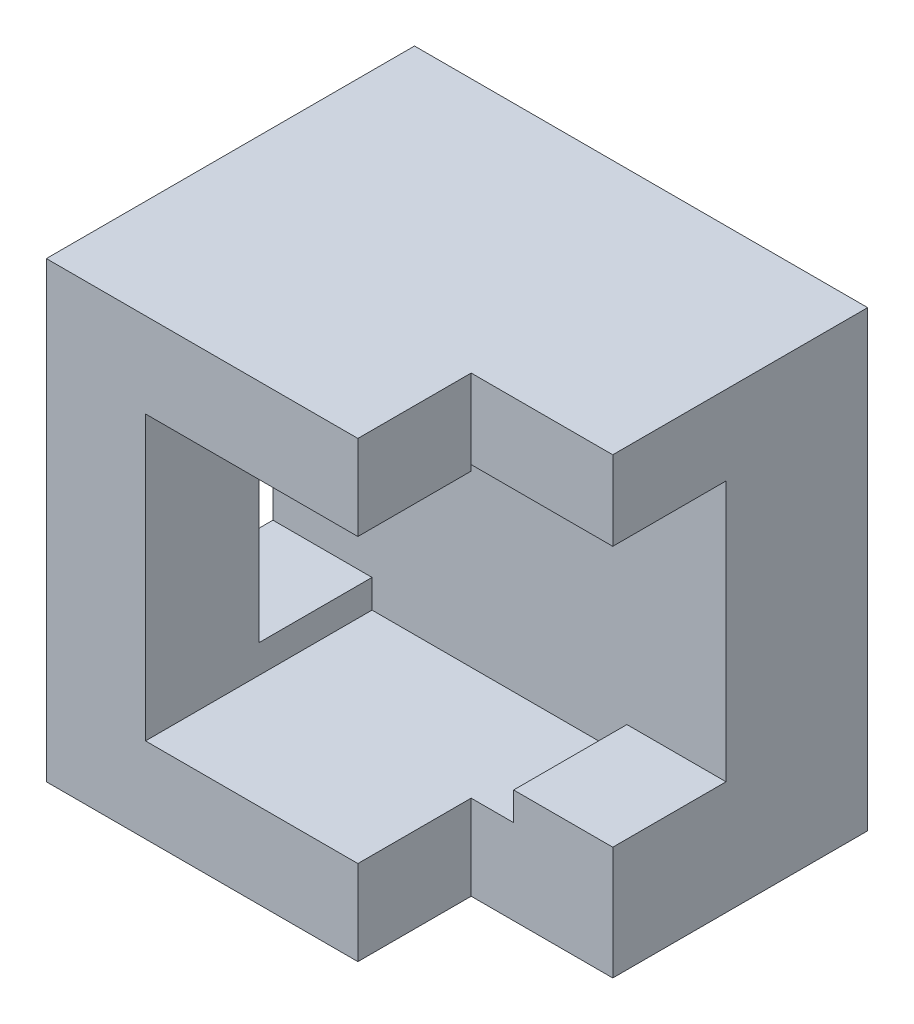
ISO-10303-21;
HEADER;
FILE_DESCRIPTION(('STEP AP214'),'2;1');
FILE_NAME('part.step','',(''),(''),'','','');
FILE_SCHEMA(('AUTOMOTIVE_DESIGN { 1 0 10303 214 1 1 1 1 }'));
ENDSEC;
DATA;
#1=APPLICATION_CONTEXT('core data for automotive mechanical design processes');
#2=APPLICATION_PROTOCOL_DEFINITION('international standard','automotive_design',2000,#1);
#3=PRODUCT_CONTEXT('',#1,'mechanical');
#4=PRODUCT('Part','Part','',(#3));
#5=PRODUCT_RELATED_PRODUCT_CATEGORY('part','',(#4));
#6=PRODUCT_DEFINITION_FORMATION('','',#4);
#7=PRODUCT_DEFINITION_CONTEXT('part definition',#1,'design');
#8=PRODUCT_DEFINITION('design','',#6,#7);
#9=PRODUCT_DEFINITION_SHAPE('','',#8);
#10=(LENGTH_UNIT() NAMED_UNIT(*) SI_UNIT(.MILLI.,.METRE.));
#11=(NAMED_UNIT(*) PLANE_ANGLE_UNIT() SI_UNIT($,.RADIAN.));
#12=(NAMED_UNIT(*) SI_UNIT($,.STERADIAN.) SOLID_ANGLE_UNIT());
#13=UNCERTAINTY_MEASURE_WITH_UNIT(LENGTH_MEASURE(1.E-05),#10,'distance_accuracy_value','');
#14=(GEOMETRIC_REPRESENTATION_CONTEXT(3) GLOBAL_UNCERTAINTY_ASSIGNED_CONTEXT((#13)) GLOBAL_UNIT_ASSIGNED_CONTEXT((#10,
#11,#12)) REPRESENTATION_CONTEXT('',''));
#15=CARTESIAN_POINT('',(0.,0.,0.));
#16=DIRECTION('',(0.,0.,1.));
#17=DIRECTION('',(1.,0.,0.));
#18=AXIS2_PLACEMENT_3D('',#15,#16,#17);
#19=CARTESIAN_POINT('',(-40.,40.,65.));
#20=DIRECTION('',(1.,0.,0.));
#21=DIRECTION('',(0.,1.,0.));
#22=AXIS2_PLACEMENT_3D('',#19,#20,#21);
#23=PLANE('',#22);
#24=DIRECTION('',(0.,0.,1.));
#25=VECTOR('',#24,1.);
#26=CARTESIAN_POINT('',(-40.,26.,44.9999999999998));
#27=LINE('',#26,#25);
#28=CARTESIAN_POINT('',(-40.,26.,25.));
#29=VERTEX_POINT('',#28);
#30=CARTESIAN_POINT('',(-40.,26.,44.9999999999998));
#31=VERTEX_POINT('',#30);
#32=EDGE_CURVE('E259',#29,#31,#27,.T.);
#33=ORIENTED_EDGE('',*,*,#32,.T.);
#34=DIRECTION('',(0.,-1.,0.));
#35=VECTOR('',#34,1.);
#36=CARTESIAN_POINT('',(-40.,-20.,44.9999999999998));
#37=LINE('',#36,#35);
#38=CARTESIAN_POINT('',(-40.,-20.,44.9999999999998));
#39=VERTEX_POINT('',#38);
#40=EDGE_CURVE('E251',#31,#39,#37,.T.);
#41=ORIENTED_EDGE('',*,*,#40,.T.);
#42=DIRECTION('',(0.,0.,-1.));
#43=VECTOR('',#42,1.);
#44=CARTESIAN_POINT('',(-40.,-20.,44.9999999999998));
#45=LINE('',#44,#43);
#46=CARTESIAN_POINT('',(-40.,-20.,25.));
#47=VERTEX_POINT('',#46);
#48=EDGE_CURVE('E263',#39,#47,#45,.T.);
#49=ORIENTED_EDGE('',*,*,#48,.T.);
#50=DIRECTION('',(0.,1.,0.));
#51=VECTOR('',#50,1.);
#52=CARTESIAN_POINT('',(-40.,-20.,25.));
#53=LINE('',#52,#51);
#54=EDGE_CURVE('E55',#47,#29,#53,.T.);
#55=ORIENTED_EDGE('',*,*,#54,.T.);
#56=EDGE_LOOP('',(#33,#41,#49,#55));
#57=FACE_BOUND('',#56,.T.);
#58=DIRECTION('',(0.,-1.,0.));
#59=VECTOR('',#58,1.);
#60=CARTESIAN_POINT('',(-40.,40.,0.));
#61=LINE('',#60,#59);
#62=CARTESIAN_POINT('',(-40.,40.,0.));
#63=VERTEX_POINT('',#62);
#64=CARTESIAN_POINT('',(-40.,-40.,0.));
#65=VERTEX_POINT('',#64);
#66=EDGE_CURVE('E192',#63,#65,#61,.T.);
#67=ORIENTED_EDGE('',*,*,#66,.T.);
#68=DIRECTION('',(0.,0.,-1.));
#69=VECTOR('',#68,1.);
#70=CARTESIAN_POINT('',(-40.,-40.,65.));
#71=LINE('',#70,#69);
#72=CARTESIAN_POINT('',(-40.,-40.,65.));
#73=VERTEX_POINT('',#72);
#74=EDGE_CURVE('E11',#73,#65,#71,.T.);
#75=ORIENTED_EDGE('',*,*,#74,.F.);
#76=DIRECTION('',(0.,-1.,0.));
#77=VECTOR('',#76,1.);
#78=CARTESIAN_POINT('',(-40.,40.,65.));
#79=LINE('',#78,#77);
#80=CARTESIAN_POINT('',(-40.,40.,65.));
#81=VERTEX_POINT('',#80);
#82=EDGE_CURVE('E187',#81,#73,#79,.T.);
#83=ORIENTED_EDGE('',*,*,#82,.F.);
#84=DIRECTION('',(0.,0.,-1.));
#85=VECTOR('',#84,1.);
#86=CARTESIAN_POINT('',(-40.,40.,65.));
#87=LINE('',#86,#85);
#88=EDGE_CURVE('E179',#81,#63,#87,.T.);
#89=ORIENTED_EDGE('',*,*,#88,.T.);
#90=EDGE_LOOP('',(#67,#75,#83,#89));
#91=FACE_BOUND('',#90,.T.);
#92=ADVANCED_FACE('F33',(#57,#91),#23,.F.);
#93=CARTESIAN_POINT('',(-40.,-40.,65.));
#94=DIRECTION('',(0.,1.,0.));
#95=DIRECTION('',(-1.,0.,0.));
#96=AXIS2_PLACEMENT_3D('',#93,#94,#95);
#97=PLANE('',#96);
#98=DIRECTION('',(0.,0.,-1.));
#99=VECTOR('',#98,1.);
#100=CARTESIAN_POINT('',(40.,-40.,65.));
#101=LINE('',#100,#99);
#102=CARTESIAN_POINT('',(40.,-40.,44.9999999999998));
#103=VERTEX_POINT('',#102);
#104=CARTESIAN_POINT('',(40.,-40.,0.));
#105=VERTEX_POINT('',#104);
#106=EDGE_CURVE('E40',#103,#105,#101,.T.);
#107=ORIENTED_EDGE('',*,*,#106,.F.);
#108=DIRECTION('',(1.,0.,0.));
#109=VECTOR('',#108,1.);
#110=CARTESIAN_POINT('',(14.9999999999999,-40.,44.9999999999995));
#111=LINE('',#110,#109);
#112=CARTESIAN_POINT('',(14.9999999999999,-40.,44.9999999999995));
#113=VERTEX_POINT('',#112);
#114=EDGE_CURVE('E286',#113,#103,#111,.T.);
#115=ORIENTED_EDGE('',*,*,#114,.F.);
#116=DIRECTION('',(0.,0.,-1.));
#117=VECTOR('',#116,1.);
#118=CARTESIAN_POINT('',(14.9999999999999,-40.,44.9999999999995));
#119=LINE('',#118,#117);
#120=CARTESIAN_POINT('',(14.9999999999999,-40.,64.9999999999999));
#121=VERTEX_POINT('',#120);
#122=EDGE_CURVE('E173',#121,#113,#119,.T.);
#123=ORIENTED_EDGE('',*,*,#122,.F.);
#124=DIRECTION('',(1.,0.,0.));
#125=VECTOR('',#124,1.);
#126=CARTESIAN_POINT('',(-40.,-40.,65.));
#127=LINE('',#126,#125);
#128=EDGE_CURVE('E197',#73,#121,#127,.T.);
#129=ORIENTED_EDGE('',*,*,#128,.F.);
#130=ORIENTED_EDGE('',*,*,#74,.T.);
#131=DIRECTION('',(1.,0.,0.));
#132=VECTOR('',#131,1.);
#133=CARTESIAN_POINT('',(-40.,-40.,0.));
#134=LINE('',#133,#132);
#135=EDGE_CURVE('E189',#65,#105,#134,.T.);
#136=ORIENTED_EDGE('',*,*,#135,.T.);
#137=EDGE_LOOP('',(#107,#115,#123,#129,#130,#136));
#138=FACE_BOUND('',#137,.T.);
#139=ADVANCED_FACE('F296',(#138),#97,.F.);
#140=CARTESIAN_POINT('',(40.,40.,65.));
#141=DIRECTION('',(-1.,0.,0.));
#142=DIRECTION('',(0.,0.,1.));
#143=AXIS2_PLACEMENT_3D('',#140,#141,#142);
#144=PLANE('',#143);
#145=DIRECTION('',(0.,0.,-1.));
#146=VECTOR('',#145,1.);
#147=CARTESIAN_POINT('',(40.,40.,65.));
#148=LINE('',#147,#146);
#149=CARTESIAN_POINT('',(40.,40.,44.9999999999998));
#150=VERTEX_POINT('',#149);
#151=CARTESIAN_POINT('',(40.,40.,0.));
#152=VERTEX_POINT('',#151);
#153=EDGE_CURVE('E169',#150,#152,#148,.T.);
#154=ORIENTED_EDGE('',*,*,#153,.F.);
#155=DIRECTION('',(0.,-1.,0.));
#156=VECTOR('',#155,1.);
#157=CARTESIAN_POINT('',(40.,40.,44.9999999999998));
#158=LINE('',#157,#156);
#159=CARTESIAN_POINT('',(40.,26.,44.9999999999998));
#160=VERTEX_POINT('',#159);
#161=EDGE_CURVE('E153',#150,#160,#158,.T.);
#162=ORIENTED_EDGE('',*,*,#161,.T.);
#163=DIRECTION('',(0.,0.,1.));
#164=VECTOR('',#163,1.);
#165=CARTESIAN_POINT('',(40.,26.,44.9999999999998));
#166=LINE('',#165,#164);
#167=CARTESIAN_POINT('',(40.,26.,25.));
#168=VERTEX_POINT('',#167);
#169=EDGE_CURVE('E249',#168,#160,#166,.T.);
#170=ORIENTED_EDGE('',*,*,#169,.F.);
#171=DIRECTION('',(0.,1.,0.));
#172=VECTOR('',#171,1.);
#173=CARTESIAN_POINT('',(40.,-20.,25.));
#174=LINE('',#173,#172);
#175=CARTESIAN_POINT('',(40.,-20.,25.));
#176=VERTEX_POINT('',#175);
#177=EDGE_CURVE('E252',#176,#168,#174,.T.);
#178=ORIENTED_EDGE('',*,*,#177,.F.);
#179=DIRECTION('',(0.,0.,-1.));
#180=VECTOR('',#179,1.);
#181=CARTESIAN_POINT('',(40.,-20.,44.9999999999998));
#182=LINE('',#181,#180);
#183=CARTESIAN_POINT('',(40.,-20.,44.9999999999998));
#184=VERTEX_POINT('',#183);
#185=EDGE_CURVE('E255',#184,#176,#182,.T.);
#186=ORIENTED_EDGE('',*,*,#185,.F.);
#187=EDGE_CURVE('E165',#184,#103,#158,.T.);
#188=ORIENTED_EDGE('',*,*,#187,.T.);
#189=ORIENTED_EDGE('',*,*,#106,.T.);
#190=DIRECTION('',(0.,1.,0.));
#191=VECTOR('',#190,1.);
#192=CARTESIAN_POINT('',(40.,40.,0.));
#193=LINE('',#192,#191);
#194=EDGE_CURVE('E177',#105,#152,#193,.T.);
#195=ORIENTED_EDGE('',*,*,#194,.T.);
#196=EDGE_LOOP('',(#154,#162,#170,#178,#186,#188,#189,#195));
#197=FACE_BOUND('',#196,.T.);
#198=ADVANCED_FACE('F175',(#197),#144,.F.);
#199=CARTESIAN_POINT('',(-40.,40.,65.));
#200=DIRECTION('',(0.,-1.,0.));
#201=DIRECTION('',(1.,0.,0.));
#202=AXIS2_PLACEMENT_3D('',#199,#200,#201);
#203=PLANE('',#202);
#204=DIRECTION('',(0.,0.,-1.));
#205=VECTOR('',#204,1.);
#206=CARTESIAN_POINT('',(14.9999999999998,40.,44.9999999999995));
#207=LINE('',#206,#205);
#208=CARTESIAN_POINT('',(14.9999999999999,40.,64.9999999999999));
#209=VERTEX_POINT('',#208);
#210=CARTESIAN_POINT('',(14.9999999999998,40.,44.9999999999995));
#211=VERTEX_POINT('',#210);
#212=EDGE_CURVE('E172',#209,#211,#207,.T.);
#213=ORIENTED_EDGE('',*,*,#212,.T.);
#214=DIRECTION('',(1.,0.,0.));
#215=VECTOR('',#214,1.);
#216=CARTESIAN_POINT('',(14.9999999999998,40.,44.9999999999995));
#217=LINE('',#216,#215);
#218=EDGE_CURVE('E156',#211,#150,#217,.T.);
#219=ORIENTED_EDGE('',*,*,#218,.T.);
#220=ORIENTED_EDGE('',*,*,#153,.T.);
#221=DIRECTION('',(-1.,0.,0.));
#222=VECTOR('',#221,1.);
#223=CARTESIAN_POINT('',(-40.,40.,0.));
#224=LINE('',#223,#222);
#225=EDGE_CURVE('E185',#152,#63,#224,.T.);
#226=ORIENTED_EDGE('',*,*,#225,.T.);
#227=ORIENTED_EDGE('',*,*,#88,.F.);
#228=DIRECTION('',(-1.,0.,0.));
#229=VECTOR('',#228,1.);
#230=CARTESIAN_POINT('',(-40.,40.,65.));
#231=LINE('',#230,#229);
#232=EDGE_CURVE('E182',#209,#81,#231,.T.);
#233=ORIENTED_EDGE('',*,*,#232,.F.);
#234=EDGE_LOOP('',(#213,#219,#220,#226,#227,#233));
#235=FACE_BOUND('',#234,.T.);
#236=ADVANCED_FACE('F168',(#235),#203,.F.);
#237=CARTESIAN_POINT('',(0.,0.,65.));
#238=DIRECTION('',(0.,0.,1.));
#239=DIRECTION('',(1.,0.,0.));
#240=AXIS2_PLACEMENT_3D('',#237,#238,#239);
#241=PLANE('',#240);
#242=DIRECTION('',(0.,-1.,0.));
#243=VECTOR('',#242,1.);
#244=CARTESIAN_POINT('',(14.9999999999999,40.,64.9999999999999));
#245=LINE('',#244,#243);
#246=CARTESIAN_POINT('',(14.9999999999999,25.,64.9999999999999));
#247=VERTEX_POINT('',#246);
#248=EDGE_CURVE('E279',#209,#247,#245,.T.);
#249=ORIENTED_EDGE('',*,*,#248,.F.);
#250=ORIENTED_EDGE('',*,*,#232,.T.);
#251=ORIENTED_EDGE('',*,*,#82,.T.);
#252=ORIENTED_EDGE('',*,*,#128,.T.);
#253=CARTESIAN_POINT('',(14.9999999999999,-25.,64.9999999999999));
#254=VERTEX_POINT('',#253);
#255=EDGE_CURVE('E164',#254,#121,#245,.T.);
#256=ORIENTED_EDGE('',*,*,#255,.F.);
#257=DIRECTION('',(1.,0.,0.));
#258=VECTOR('',#257,1.);
#259=CARTESIAN_POINT('',(-22.5,-25.,65.));
#260=LINE('',#259,#258);
#261=CARTESIAN_POINT('',(-22.5,-25.,65.));
#262=VERTEX_POINT('',#261);
#263=EDGE_CURVE('E214',#262,#254,#260,.T.);
#264=ORIENTED_EDGE('',*,*,#263,.F.);
#265=DIRECTION('',(0.,-1.,0.));
#266=VECTOR('',#265,1.);
#267=CARTESIAN_POINT('',(-22.5,25.,65.));
#268=LINE('',#267,#266);
#269=CARTESIAN_POINT('',(-22.5,25.,65.));
#270=VERTEX_POINT('',#269);
#271=EDGE_CURVE('E217',#270,#262,#268,.T.);
#272=ORIENTED_EDGE('',*,*,#271,.F.);
#273=DIRECTION('',(-1.,0.,0.));
#274=VECTOR('',#273,1.);
#275=CARTESIAN_POINT('',(-22.5,25.,65.));
#276=LINE('',#275,#274);
#277=EDGE_CURVE('E211',#247,#270,#276,.T.);
#278=ORIENTED_EDGE('',*,*,#277,.F.);
#279=EDGE_LOOP('',(#249,#250,#251,#252,#256,#264,#272,#278));
#280=FACE_BOUND('',#279,.T.);
#281=ADVANCED_FACE('F307',(#280),#241,.T.);
#282=CARTESIAN_POINT('',(0.,0.,0.));
#283=DIRECTION('',(0.,0.,1.));
#284=DIRECTION('',(1.,0.,0.));
#285=AXIS2_PLACEMENT_3D('',#282,#283,#284);
#286=PLANE('',#285);
#287=ORIENTED_EDGE('',*,*,#66,.F.);
#288=ORIENTED_EDGE('',*,*,#225,.F.);
#289=ORIENTED_EDGE('',*,*,#194,.F.);
#290=ORIENTED_EDGE('',*,*,#135,.F.);
#291=EDGE_LOOP('',(#287,#288,#289,#290));
#292=FACE_BOUND('',#291,.T.);
#293=ADVANCED_FACE('F301',(#292),#286,.F.);
#294=CARTESIAN_POINT('',(-22.5,25.,25.));
#295=DIRECTION('',(-1.,0.,0.));
#296=DIRECTION('',(0.,-1.,0.));
#297=AXIS2_PLACEMENT_3D('',#294,#295,#296);
#298=PLANE('',#297);
#299=DIRECTION('',(0.,0.,1.));
#300=VECTOR('',#299,1.);
#301=CARTESIAN_POINT('',(-22.5,-20.,25.));
#302=LINE('',#301,#300);
#303=CARTESIAN_POINT('',(-22.5,-20.,25.));
#304=VERTEX_POINT('',#303);
#305=CARTESIAN_POINT('',(-22.5,-20.,44.9999999999998));
#306=VERTEX_POINT('',#305);
#307=EDGE_CURVE('E231',#304,#306,#302,.T.);
#308=ORIENTED_EDGE('',*,*,#307,.T.);
#309=DIRECTION('',(0.,1.,0.));
#310=VECTOR('',#309,1.);
#311=CARTESIAN_POINT('',(-22.5,25.,44.9999999999998));
#312=LINE('',#311,#310);
#313=CARTESIAN_POINT('',(-22.5,25.,44.9999999999998));
#314=VERTEX_POINT('',#313);
#315=EDGE_CURVE('E219',#306,#314,#312,.T.);
#316=ORIENTED_EDGE('',*,*,#315,.T.);
#317=DIRECTION('',(0.,0.,1.));
#318=VECTOR('',#317,1.);
#319=CARTESIAN_POINT('',(-22.5,25.,25.));
#320=LINE('',#319,#318);
#321=EDGE_CURVE('E195',#314,#270,#320,.T.);
#322=ORIENTED_EDGE('',*,*,#321,.T.);
#323=ORIENTED_EDGE('',*,*,#271,.T.);
#324=DIRECTION('',(0.,0.,1.));
#325=VECTOR('',#324,1.);
#326=CARTESIAN_POINT('',(-22.5,-25.,25.));
#327=LINE('',#326,#325);
#328=CARTESIAN_POINT('',(-22.5,-25.,25.));
#329=VERTEX_POINT('',#328);
#330=EDGE_CURVE('E202',#329,#262,#327,.T.);
#331=ORIENTED_EDGE('',*,*,#330,.F.);
#332=DIRECTION('',(0.,-1.,0.));
#333=VECTOR('',#332,1.);
#334=CARTESIAN_POINT('',(-22.5,25.,25.));
#335=LINE('',#334,#333);
#336=EDGE_CURVE('E213',#304,#329,#335,.T.);
#337=ORIENTED_EDGE('',*,*,#336,.F.);
#338=EDGE_LOOP('',(#308,#316,#322,#323,#331,#337));
#339=FACE_BOUND('',#338,.T.);
#340=ADVANCED_FACE('F320',(#339),#298,.F.);
#341=CARTESIAN_POINT('',(-22.5,25.,25.));
#342=DIRECTION('',(0.,1.,0.));
#343=DIRECTION('',(-1.,0.,0.));
#344=AXIS2_PLACEMENT_3D('',#341,#342,#343);
#345=PLANE('',#344);
#346=DIRECTION('',(1.,0.,0.));
#347=VECTOR('',#346,1.);
#348=CARTESIAN_POINT('',(-22.5,25.,44.9999999999998));
#349=LINE('',#348,#347);
#350=CARTESIAN_POINT('',(14.9999999999998,25.,44.9999999999995));
#351=VERTEX_POINT('',#350);
#352=EDGE_CURVE('E228',#314,#351,#349,.T.);
#353=ORIENTED_EDGE('',*,*,#352,.T.);
#354=DIRECTION('',(0.,0.,1.));
#355=VECTOR('',#354,1.);
#356=CARTESIAN_POINT('',(14.9999999999998,25.,24.9999999999999));
#357=LINE('',#356,#355);
#358=EDGE_CURVE('E258',#351,#247,#357,.T.);
#359=ORIENTED_EDGE('',*,*,#358,.T.);
#360=ORIENTED_EDGE('',*,*,#277,.T.);
#361=ORIENTED_EDGE('',*,*,#321,.F.);
#362=EDGE_LOOP('',(#353,#359,#360,#361));
#363=FACE_BOUND('',#362,.T.);
#364=ADVANCED_FACE('F315',(#363),#345,.F.);
#365=CARTESIAN_POINT('',(22.5,25.,25.));
#366=DIRECTION('',(1.,0.,0.));
#367=DIRECTION('',(0.,1.,0.));
#368=AXIS2_PLACEMENT_3D('',#365,#366,#367);
#369=PLANE('',#368);
#370=DIRECTION('',(0.,0.,1.));
#371=VECTOR('',#370,1.);
#372=CARTESIAN_POINT('',(22.5,-25.,25.));
#373=LINE('',#372,#371);
#374=CARTESIAN_POINT('',(22.5,-25.,25.));
#375=VERTEX_POINT('',#374);
#376=CARTESIAN_POINT('',(22.5,-25.,44.9999999999996));
#377=VERTEX_POINT('',#376);
#378=EDGE_CURVE('E205',#375,#377,#373,.T.);
#379=ORIENTED_EDGE('',*,*,#378,.T.);
#380=DIRECTION('',(0.,1.,0.));
#381=VECTOR('',#380,1.);
#382=CARTESIAN_POINT('',(22.5,25.,44.9999999999996));
#383=LINE('',#382,#381);
#384=CARTESIAN_POINT('',(22.5,-20.,45.0000000000005));
#385=VERTEX_POINT('',#384);
#386=EDGE_CURVE('E273',#377,#385,#383,.T.);
#387=ORIENTED_EDGE('',*,*,#386,.T.);
#388=DIRECTION('',(0.,0.,-1.));
#389=VECTOR('',#388,1.);
#390=CARTESIAN_POINT('',(22.5,-20.,25.));
#391=LINE('',#390,#389);
#392=CARTESIAN_POINT('',(22.5,-20.,25.));
#393=VERTEX_POINT('',#392);
#394=EDGE_CURVE('E234',#385,#393,#391,.T.);
#395=ORIENTED_EDGE('',*,*,#394,.T.);
#396=DIRECTION('',(0.,1.,0.));
#397=VECTOR('',#396,1.);
#398=CARTESIAN_POINT('',(22.5,25.,25.));
#399=LINE('',#398,#397);
#400=EDGE_CURVE('E206',#375,#393,#399,.T.);
#401=ORIENTED_EDGE('',*,*,#400,.F.);
#402=EDGE_LOOP('',(#379,#387,#395,#401));
#403=FACE_BOUND('',#402,.T.);
#404=ADVANCED_FACE('F333',(#403),#369,.F.);
#405=CARTESIAN_POINT('',(-22.5,-25.,25.));
#406=DIRECTION('',(0.,-1.,0.));
#407=DIRECTION('',(0.,0.,-1.));
#408=AXIS2_PLACEMENT_3D('',#405,#406,#407);
#409=PLANE('',#408);
#410=DIRECTION('',(0.,0.,-1.));
#411=VECTOR('',#410,1.);
#412=CARTESIAN_POINT('',(14.9999999999998,-25.,24.9999999999999));
#413=LINE('',#412,#411);
#414=CARTESIAN_POINT('',(14.9999999999999,-25.,44.9999999999995));
#415=VERTEX_POINT('',#414);
#416=EDGE_CURVE('E270',#254,#415,#413,.T.);
#417=ORIENTED_EDGE('',*,*,#416,.T.);
#418=DIRECTION('',(1.,0.,0.));
#419=VECTOR('',#418,1.);
#420=CARTESIAN_POINT('',(-22.5000000000002,-25.,44.9999999999991));
#421=LINE('',#420,#419);
#422=EDGE_CURVE('E274',#415,#377,#421,.T.);
#423=ORIENTED_EDGE('',*,*,#422,.T.);
#424=ORIENTED_EDGE('',*,*,#378,.F.);
#425=DIRECTION('',(1.,0.,0.));
#426=VECTOR('',#425,1.);
#427=CARTESIAN_POINT('',(-22.5,-25.,25.));
#428=LINE('',#427,#426);
#429=EDGE_CURVE('E222',#329,#375,#428,.T.);
#430=ORIENTED_EDGE('',*,*,#429,.F.);
#431=ORIENTED_EDGE('',*,*,#330,.T.);
#432=ORIENTED_EDGE('',*,*,#263,.T.);
#433=EDGE_LOOP('',(#417,#423,#424,#430,#431,#432));
#434=FACE_BOUND('',#433,.T.);
#435=ADVANCED_FACE('F330',(#434),#409,.F.);
#436=CARTESIAN_POINT('',(0.,0.,25.));
#437=DIRECTION('',(0.,0.,1.));
#438=DIRECTION('',(1.,0.,0.));
#439=AXIS2_PLACEMENT_3D('',#436,#437,#438);
#440=PLANE('',#439);
#441=DIRECTION('',(1.,0.,0.));
#442=VECTOR('',#441,1.);
#443=CARTESIAN_POINT('',(-40.,-20.,25.));
#444=LINE('',#443,#442);
#445=EDGE_CURVE('E243',#47,#304,#444,.T.);
#446=ORIENTED_EDGE('',*,*,#445,.T.);
#447=ORIENTED_EDGE('',*,*,#336,.T.);
#448=ORIENTED_EDGE('',*,*,#429,.T.);
#449=ORIENTED_EDGE('',*,*,#400,.T.);
#450=EDGE_CURVE('E241',#393,#176,#444,.T.);
#451=ORIENTED_EDGE('',*,*,#450,.T.);
#452=ORIENTED_EDGE('',*,*,#177,.T.);
#453=DIRECTION('',(1.,0.,0.));
#454=VECTOR('',#453,1.);
#455=CARTESIAN_POINT('',(-40.,26.,25.));
#456=LINE('',#455,#454);
#457=EDGE_CURVE('E245',#29,#168,#456,.T.);
#458=ORIENTED_EDGE('',*,*,#457,.F.);
#459=ORIENTED_EDGE('',*,*,#54,.F.);
#460=EDGE_LOOP('',(#446,#447,#448,#449,#451,#452,#458,#459));
#461=FACE_BOUND('',#460,.T.);
#462=ADVANCED_FACE('F326',(#461),#440,.T.);
#463=CARTESIAN_POINT('',(-40.,-20.,44.9999999999998));
#464=DIRECTION('',(0.,0.,1.));
#465=DIRECTION('',(1.,0.,0.));
#466=AXIS2_PLACEMENT_3D('',#463,#464,#465);
#467=PLANE('',#466);
#468=DIRECTION('',(1.,0.,0.));
#469=VECTOR('',#468,1.);
#470=CARTESIAN_POINT('',(-40.,26.,44.9999999999998));
#471=LINE('',#470,#469);
#472=CARTESIAN_POINT('',(14.9999999999998,26.,44.9999999999998));
#473=VERTEX_POINT('',#472);
#474=EDGE_CURVE('E237',#31,#473,#471,.T.);
#475=ORIENTED_EDGE('',*,*,#474,.T.);
#476=DIRECTION('',(0.,-1.,0.));
#477=VECTOR('',#476,1.);
#478=CARTESIAN_POINT('',(14.9999999999998,40.,44.9999999999995));
#479=LINE('',#478,#477);
#480=EDGE_CURVE('E283',#473,#351,#479,.T.);
#481=ORIENTED_EDGE('',*,*,#480,.T.);
#482=ORIENTED_EDGE('',*,*,#352,.F.);
#483=ORIENTED_EDGE('',*,*,#315,.F.);
#484=DIRECTION('',(1.,0.,0.));
#485=VECTOR('',#484,1.);
#486=CARTESIAN_POINT('',(-40.,-20.,44.9999999999998));
#487=LINE('',#486,#485);
#488=EDGE_CURVE('E238',#39,#306,#487,.T.);
#489=ORIENTED_EDGE('',*,*,#488,.F.);
#490=ORIENTED_EDGE('',*,*,#40,.F.);
#491=EDGE_LOOP('',(#475,#481,#482,#483,#489,#490));
#492=FACE_BOUND('',#491,.T.);
#493=ADVANCED_FACE('F318',(#492),#467,.F.);
#494=CARTESIAN_POINT('',(-40.,-20.,44.9999999999998));
#495=DIRECTION('',(0.,-1.,0.));
#496=DIRECTION('',(0.,0.,-1.));
#497=AXIS2_PLACEMENT_3D('',#494,#495,#496);
#498=PLANE('',#497);
#499=ORIENTED_EDGE('',*,*,#445,.F.);
#500=ORIENTED_EDGE('',*,*,#48,.F.);
#501=ORIENTED_EDGE('',*,*,#488,.T.);
#502=ORIENTED_EDGE('',*,*,#307,.F.);
#503=EDGE_LOOP('',(#499,#500,#501,#502));
#504=FACE_BOUND('',#503,.T.);
#505=ADVANCED_FACE('F324',(#504),#498,.F.);
#506=EDGE_CURVE('E242',#385,#184,#487,.T.);
#507=ORIENTED_EDGE('',*,*,#506,.T.);
#508=ORIENTED_EDGE('',*,*,#185,.T.);
#509=ORIENTED_EDGE('',*,*,#450,.F.);
#510=ORIENTED_EDGE('',*,*,#394,.F.);
#511=EDGE_LOOP('',(#507,#508,#509,#510));
#512=FACE_BOUND('',#511,.T.);
#513=ADVANCED_FACE('F336',(#512),#498,.F.);
#514=CARTESIAN_POINT('',(-40.,26.,44.9999999999998));
#515=DIRECTION('',(0.,1.,0.));
#516=DIRECTION('',(0.,0.,1.));
#517=AXIS2_PLACEMENT_3D('',#514,#515,#516);
#518=PLANE('',#517);
#519=ORIENTED_EDGE('',*,*,#169,.T.);
#520=EDGE_CURVE('E159',#473,#160,#471,.T.);
#521=ORIENTED_EDGE('',*,*,#520,.F.);
#522=ORIENTED_EDGE('',*,*,#474,.F.);
#523=ORIENTED_EDGE('',*,*,#32,.F.);
#524=ORIENTED_EDGE('',*,*,#457,.T.);
#525=EDGE_LOOP('',(#519,#521,#522,#523,#524));
#526=FACE_BOUND('',#525,.T.);
#527=ADVANCED_FACE('F338',(#526),#518,.F.);
#528=CARTESIAN_POINT('',(14.9999999999998,40.,44.9999999999995));
#529=DIRECTION('',(0.,0.,-1.));
#530=DIRECTION('',(-1.,0.,0.));
#531=AXIS2_PLACEMENT_3D('',#528,#529,#530);
#532=PLANE('',#531);
#533=ORIENTED_EDGE('',*,*,#161,.F.);
#534=ORIENTED_EDGE('',*,*,#218,.F.);
#535=EDGE_CURVE('E47',#211,#473,#479,.T.);
#536=ORIENTED_EDGE('',*,*,#535,.T.);
#537=ORIENTED_EDGE('',*,*,#520,.T.);
#538=EDGE_LOOP('',(#533,#534,#536,#537));
#539=FACE_BOUND('',#538,.T.);
#540=ADVANCED_FACE('F155',(#539),#532,.F.);
#541=CARTESIAN_POINT('',(14.9999999999998,40.,44.9999999999995));
#542=DIRECTION('',(-1.,0.,0.));
#543=DIRECTION('',(0.,0.,1.));
#544=AXIS2_PLACEMENT_3D('',#541,#542,#543);
#545=PLANE('',#544);
#546=ORIENTED_EDGE('',*,*,#480,.F.);
#547=ORIENTED_EDGE('',*,*,#535,.F.);
#548=ORIENTED_EDGE('',*,*,#212,.F.);
#549=ORIENTED_EDGE('',*,*,#248,.T.);
#550=ORIENTED_EDGE('',*,*,#358,.F.);
#551=EDGE_LOOP('',(#546,#547,#548,#549,#550));
#552=FACE_BOUND('',#551,.T.);
#553=ADVANCED_FACE('F312',(#552),#545,.F.);
#554=ORIENTED_EDGE('',*,*,#255,.T.);
#555=ORIENTED_EDGE('',*,*,#122,.T.);
#556=EDGE_CURVE('E281',#415,#113,#479,.T.);
#557=ORIENTED_EDGE('',*,*,#556,.F.);
#558=ORIENTED_EDGE('',*,*,#416,.F.);
#559=EDGE_LOOP('',(#554,#555,#557,#558));
#560=FACE_BOUND('',#559,.T.);
#561=ADVANCED_FACE('F378',(#560),#545,.F.);
#562=ORIENTED_EDGE('',*,*,#422,.F.);
#563=ORIENTED_EDGE('',*,*,#556,.T.);
#564=ORIENTED_EDGE('',*,*,#114,.T.);
#565=ORIENTED_EDGE('',*,*,#187,.F.);
#566=ORIENTED_EDGE('',*,*,#506,.F.);
#567=ORIENTED_EDGE('',*,*,#386,.F.);
#568=EDGE_LOOP('',(#562,#563,#564,#565,#566,#567));
#569=FACE_BOUND('',#568,.T.);
#570=ADVANCED_FACE('F375',(#569),#532,.F.);
#571=CLOSED_SHELL('',(#92,#139,#198,#236,#281,#293,#340,#364,#404,#435,#462,#493,#505,#513,#527,
#540,#553,#561,#570));
#572=MANIFOLD_SOLID_BREP('B2',#571);
#573=ADVANCED_BREP_SHAPE_REPRESENTATION('',(#18,#572),#14);
#574=SHAPE_DEFINITION_REPRESENTATION(#9,#573);
ENDSEC;
END-ISO-10303-21;
